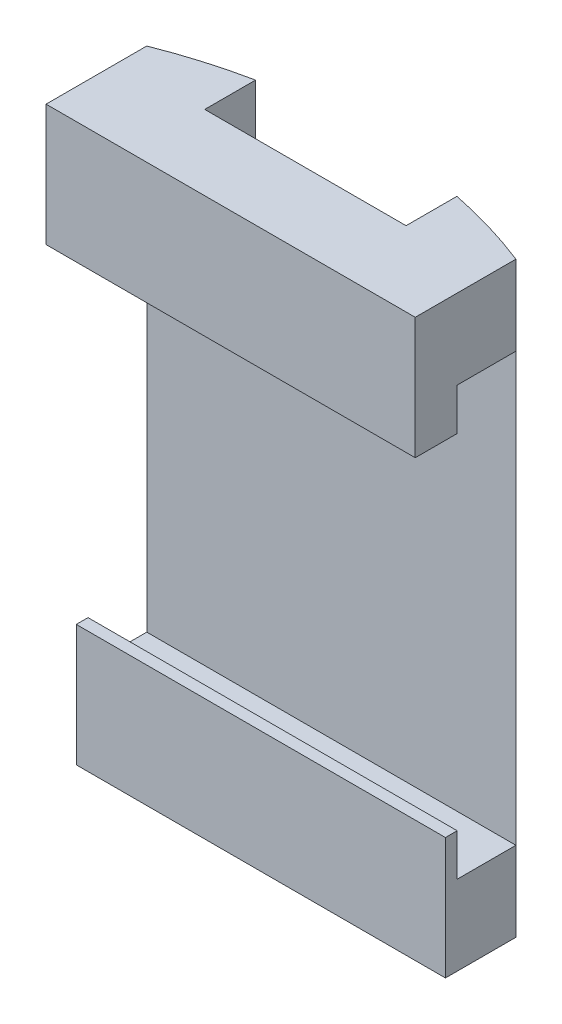
ISO-10303-21;
HEADER;
FILE_DESCRIPTION(('STEP AP214'),'2;1');
FILE_NAME('part.step','',(''),(''),'','','');
FILE_SCHEMA(('AUTOMOTIVE_DESIGN { 1 0 10303 214 1 1 1 1 }'));
ENDSEC;
DATA;
#1=APPLICATION_CONTEXT('core data for automotive mechanical design processes');
#2=APPLICATION_PROTOCOL_DEFINITION('international standard','automotive_design',2000,#1);
#3=PRODUCT_CONTEXT('',#1,'mechanical');
#4=PRODUCT('Part','Part','',(#3));
#5=PRODUCT_RELATED_PRODUCT_CATEGORY('part','',(#4));
#6=PRODUCT_DEFINITION_FORMATION('','',#4);
#7=PRODUCT_DEFINITION_CONTEXT('part definition',#1,'design');
#8=PRODUCT_DEFINITION('design','',#6,#7);
#9=PRODUCT_DEFINITION_SHAPE('','',#8);
#10=(LENGTH_UNIT() NAMED_UNIT(*) SI_UNIT(.MILLI.,.METRE.));
#11=(NAMED_UNIT(*) PLANE_ANGLE_UNIT() SI_UNIT($,.RADIAN.));
#12=(NAMED_UNIT(*) SI_UNIT($,.STERADIAN.) SOLID_ANGLE_UNIT());
#13=UNCERTAINTY_MEASURE_WITH_UNIT(LENGTH_MEASURE(1.E-05),#10,'distance_accuracy_value','');
#14=(GEOMETRIC_REPRESENTATION_CONTEXT(3) GLOBAL_UNCERTAINTY_ASSIGNED_CONTEXT((#13)) GLOBAL_UNIT_ASSIGNED_CONTEXT((#10,
#11,#12)) REPRESENTATION_CONTEXT('',''));
#15=CARTESIAN_POINT('',(0.,0.,0.));
#16=DIRECTION('',(0.,0.,1.));
#17=DIRECTION('',(1.,0.,0.));
#18=AXIS2_PLACEMENT_3D('',#15,#16,#17);
#19=CARTESIAN_POINT('',(0.,0.,0.));
#20=DIRECTION('',(0.,1.,0.));
#21=DIRECTION('',(0.,0.,1.));
#22=AXIS2_PLACEMENT_3D('',#19,#20,#21);
#23=PLANE('',#22);
#24=DIRECTION('',(1.,0.,0.));
#25=VECTOR('',#24,1.);
#26=CARTESIAN_POINT('',(-11.,0.,-23.7105714739057));
#27=LINE('',#26,#25);
#28=CARTESIAN_POINT('',(-11.,0.,-23.7105714739057));
#29=VERTEX_POINT('',#28);
#30=CARTESIAN_POINT('',(11.,0.,-23.7105714739057));
#31=VERTEX_POINT('',#30);
#32=EDGE_CURVE('E216',#29,#31,#27,.T.);
#33=ORIENTED_EDGE('',*,*,#32,.F.);
#34=DIRECTION('',(0.,0.,-1.));
#35=VECTOR('',#34,1.);
#36=CARTESIAN_POINT('',(-11.,0.,-21.9105714739057));
#37=LINE('',#36,#35);
#38=CARTESIAN_POINT('',(-11.,0.,-27.9105714739057));
#39=VERTEX_POINT('',#38);
#40=EDGE_CURVE('E293',#29,#39,#37,.T.);
#41=ORIENTED_EDGE('',*,*,#40,.T.);
#42=CARTESIAN_POINT('',(0.,0.,0.));
#43=DIRECTION('',(0.,1.,0.));
#44=DIRECTION('',(0.,0.,1.));
#45=AXIS2_PLACEMENT_3D('',#42,#43,#44);
#46=CIRCLE('',#45,30.);
#47=CARTESIAN_POINT('',(11.,0.,-27.9105714739057));
#48=VERTEX_POINT('',#47);
#49=EDGE_CURVE('E324',#48,#39,#46,.T.);
#50=ORIENTED_EDGE('',*,*,#49,.F.);
#51=DIRECTION('',(0.,0.,-1.));
#52=VECTOR('',#51,1.);
#53=CARTESIAN_POINT('',(11.,0.,-21.9105714739057));
#54=LINE('',#53,#52);
#55=EDGE_CURVE('E290',#31,#48,#54,.T.);
#56=ORIENTED_EDGE('',*,*,#55,.F.);
#57=EDGE_LOOP('',(#33,#41,#50,#56));
#58=FACE_BOUND('',#57,.T.);
#59=ADVANCED_FACE('F38',(#58),#23,.F.);
#60=CARTESIAN_POINT('',(-11.,4.75,-21.9105714739057));
#61=DIRECTION('',(1.,0.,0.));
#62=DIRECTION('',(0.,0.,-1.));
#63=AXIS2_PLACEMENT_3D('',#60,#61,#62);
#64=PLANE('',#63);
#65=DIRECTION('',(0.,-1.,0.));
#66=VECTOR('',#65,1.);
#67=CARTESIAN_POINT('',(-11.,7.25,-23.7105714739057));
#68=LINE('',#67,#66);
#69=CARTESIAN_POINT('',(-11.,7.25,-23.7105714739057));
#70=VERTEX_POINT('',#69);
#71=EDGE_CURVE('E213',#70,#29,#68,.T.);
#72=ORIENTED_EDGE('',*,*,#71,.F.);
#73=DIRECTION('',(0.,0.,-1.));
#74=VECTOR('',#73,1.);
#75=CARTESIAN_POINT('',(-11.,7.25,-21.9105714739057));
#76=LINE('',#75,#74);
#77=CARTESIAN_POINT('',(-11.,7.25,-24.4105714739057));
#78=VERTEX_POINT('',#77);
#79=EDGE_CURVE('E225',#70,#78,#76,.T.);
#80=ORIENTED_EDGE('',*,*,#79,.T.);
#81=DIRECTION('',(0.,-1.,0.));
#82=VECTOR('',#81,1.);
#83=CARTESIAN_POINT('',(-11.,4.75,-24.4105714739057));
#84=LINE('',#83,#82);
#85=CARTESIAN_POINT('',(-11.,4.75,-24.4105714739057));
#86=VERTEX_POINT('',#85);
#87=EDGE_CURVE('E230',#78,#86,#84,.T.);
#88=ORIENTED_EDGE('',*,*,#87,.T.);
#89=DIRECTION('',(0.,0.,-1.));
#90=VECTOR('',#89,1.);
#91=CARTESIAN_POINT('',(-11.,4.75,-21.9105714739057));
#92=LINE('',#91,#90);
#93=CARTESIAN_POINT('',(-11.,4.75,-27.9105714739057));
#94=VERTEX_POINT('',#93);
#95=EDGE_CURVE('E284',#86,#94,#92,.T.);
#96=ORIENTED_EDGE('',*,*,#95,.T.);
#97=DIRECTION('',(0.,-1.,0.));
#98=VECTOR('',#97,1.);
#99=CARTESIAN_POINT('',(-11.,4.75,-27.9105714739057));
#100=LINE('',#99,#98);
#101=EDGE_CURVE('E266',#94,#39,#100,.T.);
#102=ORIENTED_EDGE('',*,*,#101,.T.);
#103=ORIENTED_EDGE('',*,*,#40,.F.);
#104=EDGE_LOOP('',(#72,#80,#88,#96,#102,#103));
#105=FACE_BOUND('',#104,.T.);
#106=ADVANCED_FACE('F400',(#105),#64,.F.);
#107=CARTESIAN_POINT('',(11.,4.75,-21.9105714739057));
#108=DIRECTION('',(-1.,0.,0.));
#109=DIRECTION('',(0.,0.,1.));
#110=AXIS2_PLACEMENT_3D('',#107,#108,#109);
#111=PLANE('',#110);
#112=DIRECTION('',(0.,1.,0.));
#113=VECTOR('',#112,1.);
#114=CARTESIAN_POINT('',(11.,7.25,-23.7105714739057));
#115=LINE('',#114,#113);
#116=CARTESIAN_POINT('',(11.,7.25,-23.7105714739057));
#117=VERTEX_POINT('',#116);
#118=EDGE_CURVE('E219',#31,#117,#115,.T.);
#119=ORIENTED_EDGE('',*,*,#118,.F.);
#120=ORIENTED_EDGE('',*,*,#55,.T.);
#121=DIRECTION('',(0.,1.,0.));
#122=VECTOR('',#121,1.);
#123=CARTESIAN_POINT('',(11.,4.75,-27.9105714739057));
#124=LINE('',#123,#122);
#125=CARTESIAN_POINT('',(11.,4.75,-27.9105714739057));
#126=VERTEX_POINT('',#125);
#127=EDGE_CURVE('E276',#48,#126,#124,.T.);
#128=ORIENTED_EDGE('',*,*,#127,.T.);
#129=DIRECTION('',(0.,0.,-1.));
#130=VECTOR('',#129,1.);
#131=CARTESIAN_POINT('',(11.,4.75,-21.9105714739057));
#132=LINE('',#131,#130);
#133=CARTESIAN_POINT('',(11.,4.75,-24.4105714739057));
#134=VERTEX_POINT('',#133);
#135=EDGE_CURVE('E287',#134,#126,#132,.T.);
#136=ORIENTED_EDGE('',*,*,#135,.F.);
#137=DIRECTION('',(0.,-1.,0.));
#138=VECTOR('',#137,1.);
#139=CARTESIAN_POINT('',(11.,4.75,-24.4105714739057));
#140=LINE('',#139,#138);
#141=CARTESIAN_POINT('',(11.,7.25,-24.4105714739057));
#142=VERTEX_POINT('',#141);
#143=EDGE_CURVE('E229',#142,#134,#140,.T.);
#144=ORIENTED_EDGE('',*,*,#143,.F.);
#145=DIRECTION('',(0.,0.,-1.));
#146=VECTOR('',#145,1.);
#147=CARTESIAN_POINT('',(11.,7.25,-21.9105714739057));
#148=LINE('',#147,#146);
#149=EDGE_CURVE('E226',#117,#142,#148,.T.);
#150=ORIENTED_EDGE('',*,*,#149,.F.);
#151=EDGE_LOOP('',(#119,#120,#128,#136,#144,#150));
#152=FACE_BOUND('',#151,.T.);
#153=ADVANCED_FACE('F392',(#152),#111,.F.);
#154=CARTESIAN_POINT('',(11.,7.25,-21.9105714739057));
#155=DIRECTION('',(0.,1.,0.));
#156=DIRECTION('',(0.,0.,1.));
#157=AXIS2_PLACEMENT_3D('',#154,#155,#156);
#158=PLANE('',#157);
#159=ORIENTED_EDGE('',*,*,#79,.F.);
#160=DIRECTION('',(-1.,0.,0.));
#161=VECTOR('',#160,1.);
#162=CARTESIAN_POINT('',(-11.,7.25,-23.7105714739057));
#163=LINE('',#162,#161);
#164=EDGE_CURVE('E222',#117,#70,#163,.T.);
#165=ORIENTED_EDGE('',*,*,#164,.F.);
#166=ORIENTED_EDGE('',*,*,#149,.T.);
#167=DIRECTION('',(-1.,0.,0.));
#168=VECTOR('',#167,1.);
#169=CARTESIAN_POINT('',(11.,7.25,-24.4105714739057));
#170=LINE('',#169,#168);
#171=EDGE_CURVE('E233',#142,#78,#170,.T.);
#172=ORIENTED_EDGE('',*,*,#171,.T.);
#173=EDGE_LOOP('',(#159,#165,#166,#172));
#174=FACE_BOUND('',#173,.T.);
#175=ADVANCED_FACE('F407',(#174),#158,.T.);
#176=CARTESIAN_POINT('',(-11.,35.,-27.9105714739057));
#177=DIRECTION('',(0.,0.,-1.));
#178=DIRECTION('',(-1.,0.,0.));
#179=AXIS2_PLACEMENT_3D('',#176,#177,#178);
#180=PLANE('',#179);
#181=DIRECTION('',(-1.,0.,0.));
#182=VECTOR('',#181,1.);
#183=CARTESIAN_POINT('',(-11.,25.2,-27.9105714739057));
#184=LINE('',#183,#182);
#185=CARTESIAN_POINT('',(6.,25.2,-27.9105714739057));
#186=VERTEX_POINT('',#185);
#187=CARTESIAN_POINT('',(-6.,25.2,-27.9105714739057));
#188=VERTEX_POINT('',#187);
#189=EDGE_CURVE('E209',#186,#188,#184,.T.);
#190=ORIENTED_EDGE('',*,*,#189,.T.);
#191=DIRECTION('',(0.,1.,0.));
#192=VECTOR('',#191,1.);
#193=CARTESIAN_POINT('',(-6.,35.,-27.9105714739057));
#194=LINE('',#193,#192);
#195=CARTESIAN_POINT('',(-6.,30.25,-27.9105714739057));
#196=VERTEX_POINT('',#195);
#197=EDGE_CURVE('E201',#188,#196,#194,.T.);
#198=ORIENTED_EDGE('',*,*,#197,.T.);
#199=DIRECTION('',(1.,0.,0.));
#200=VECTOR('',#199,1.);
#201=CARTESIAN_POINT('',(-11.,30.25,-27.9105714739057));
#202=LINE('',#201,#200);
#203=CARTESIAN_POINT('',(-11.,30.25,-27.9105714739057));
#204=VERTEX_POINT('',#203);
#205=EDGE_CURVE('E301',#204,#196,#202,.T.);
#206=ORIENTED_EDGE('',*,*,#205,.F.);
#207=DIRECTION('',(0.,-1.,0.));
#208=VECTOR('',#207,1.);
#209=CARTESIAN_POINT('',(-11.,35.,-27.9105714739057));
#210=LINE('',#209,#208);
#211=EDGE_CURVE('E336',#204,#94,#210,.T.);
#212=ORIENTED_EDGE('',*,*,#211,.T.);
#213=DIRECTION('',(-1.,0.,0.));
#214=VECTOR('',#213,1.);
#215=CARTESIAN_POINT('',(-11.,4.75,-27.9105714739057));
#216=LINE('',#215,#214);
#217=EDGE_CURVE('E280',#126,#94,#216,.T.);
#218=ORIENTED_EDGE('',*,*,#217,.F.);
#219=DIRECTION('',(0.,-1.,0.));
#220=VECTOR('',#219,1.);
#221=CARTESIAN_POINT('',(11.,35.,-27.9105714739057));
#222=LINE('',#221,#220);
#223=CARTESIAN_POINT('',(11.,30.25,-27.9105714739057));
#224=VERTEX_POINT('',#223);
#225=EDGE_CURVE('E327',#224,#126,#222,.T.);
#226=ORIENTED_EDGE('',*,*,#225,.F.);
#227=CARTESIAN_POINT('',(6.,30.25,-27.9105714739057));
#228=VERTEX_POINT('',#227);
#229=EDGE_CURVE('E296',#228,#224,#202,.T.);
#230=ORIENTED_EDGE('',*,*,#229,.F.);
#231=DIRECTION('',(0.,-1.,0.));
#232=VECTOR('',#231,1.);
#233=CARTESIAN_POINT('',(6.,35.,-27.9105714739057));
#234=LINE('',#233,#232);
#235=EDGE_CURVE('E170',#228,#186,#234,.T.);
#236=ORIENTED_EDGE('',*,*,#235,.T.);
#237=EDGE_LOOP('',(#190,#198,#206,#212,#218,#226,#230,#236));
#238=FACE_BOUND('',#237,.T.);
#239=ADVANCED_FACE('F354',(#238),#180,.F.);
#240=CARTESIAN_POINT('',(0.,35.,0.));
#241=DIRECTION('',(0.,-1.,0.));
#242=DIRECTION('',(0.,0.,-1.));
#243=AXIS2_PLACEMENT_3D('',#240,#241,#242);
#244=CYLINDRICAL_SURFACE('',#243,30.);
#245=CARTESIAN_POINT('',(0.,35.,0.));
#246=DIRECTION('',(0.,1.,0.));
#247=DIRECTION('',(0.,0.,1.));
#248=AXIS2_PLACEMENT_3D('',#245,#246,#247);
#249=CIRCLE('',#248,30.);
#250=CARTESIAN_POINT('',(-6.,35.,-29.3938769133981));
#251=VERTEX_POINT('',#250);
#252=CARTESIAN_POINT('',(-11.,35.,-27.9105714739057));
#253=VERTEX_POINT('',#252);
#254=EDGE_CURVE('E328',#251,#253,#249,.T.);
#255=ORIENTED_EDGE('',*,*,#254,.F.);
#256=DIRECTION('',(0.,-1.,0.));
#257=VECTOR('',#256,1.);
#258=CARTESIAN_POINT('',(-6.,35.,-29.3938769133981));
#259=LINE('',#258,#257);
#260=CARTESIAN_POINT('',(-6.,25.2,-29.3938769133981));
#261=VERTEX_POINT('',#260);
#262=EDGE_CURVE('E205',#251,#261,#259,.T.);
#263=ORIENTED_EDGE('',*,*,#262,.T.);
#264=CARTESIAN_POINT('',(0.,25.2,0.));
#265=DIRECTION('',(0.,-1.,0.));
#266=DIRECTION('',(0.,0.,-1.));
#267=AXIS2_PLACEMENT_3D('',#264,#265,#266);
#268=CIRCLE('',#267,30.);
#269=CARTESIAN_POINT('',(6.,25.2,-29.3938769133981));
#270=VERTEX_POINT('',#269);
#271=EDGE_CURVE('E11',#261,#270,#268,.T.);
#272=ORIENTED_EDGE('',*,*,#271,.T.);
#273=DIRECTION('',(0.,-1.,0.));
#274=VECTOR('',#273,1.);
#275=CARTESIAN_POINT('',(6.,35.,-29.3938769133981));
#276=LINE('',#275,#274);
#277=CARTESIAN_POINT('',(6.,35.,-29.3938769133981));
#278=VERTEX_POINT('',#277);
#279=EDGE_CURVE('E198',#270,#278,#276,.F.);
#280=ORIENTED_EDGE('',*,*,#279,.T.);
#281=CARTESIAN_POINT('',(11.,35.,-27.9105714739057));
#282=VERTEX_POINT('',#281);
#283=EDGE_CURVE('E183',#282,#278,#249,.T.);
#284=ORIENTED_EDGE('',*,*,#283,.F.);
#285=EDGE_CURVE('E332',#282,#224,#222,.T.);
#286=ORIENTED_EDGE('',*,*,#285,.T.);
#287=ORIENTED_EDGE('',*,*,#225,.T.);
#288=ORIENTED_EDGE('',*,*,#127,.F.);
#289=ORIENTED_EDGE('',*,*,#49,.T.);
#290=ORIENTED_EDGE('',*,*,#101,.F.);
#291=ORIENTED_EDGE('',*,*,#211,.F.);
#292=EDGE_CURVE('E337',#253,#204,#210,.T.);
#293=ORIENTED_EDGE('',*,*,#292,.F.);
#294=EDGE_LOOP('',(#255,#263,#272,#280,#284,#286,#287,#288,#289,#290,#291,#293));
#295=FACE_BOUND('',#294,.T.);
#296=ADVANCED_FACE('F40',(#295),#244,.T.);
#297=CARTESIAN_POINT('',(0.,35.,0.));
#298=DIRECTION('',(0.,1.,0.));
#299=DIRECTION('',(0.,0.,1.));
#300=AXIS2_PLACEMENT_3D('',#297,#298,#299);
#301=PLANE('',#300);
#302=DIRECTION('',(0.,0.,1.));
#303=VECTOR('',#302,1.);
#304=CARTESIAN_POINT('',(-6.,35.,-26.3645475346086));
#305=LINE('',#304,#303);
#306=CARTESIAN_POINT('',(-6.,35.,-26.3645475346086));
#307=VERTEX_POINT('',#306);
#308=EDGE_CURVE('E178',#251,#307,#305,.T.);
#309=ORIENTED_EDGE('',*,*,#308,.F.);
#310=ORIENTED_EDGE('',*,*,#254,.T.);
#311=DIRECTION('',(0.,0.,-1.));
#312=VECTOR('',#311,1.);
#313=CARTESIAN_POINT('',(-11.,35.,-21.9105714739057));
#314=LINE('',#313,#312);
#315=CARTESIAN_POINT('',(-11.,35.,-21.9105714739057));
#316=VERTEX_POINT('',#315);
#317=EDGE_CURVE('E307',#316,#253,#314,.T.);
#318=ORIENTED_EDGE('',*,*,#317,.F.);
#319=DIRECTION('',(-1.,0.,0.));
#320=VECTOR('',#319,1.);
#321=CARTESIAN_POINT('',(-11.,35.,-21.9105714739057));
#322=LINE('',#321,#320);
#323=CARTESIAN_POINT('',(11.,35.,-21.9105714739057));
#324=VERTEX_POINT('',#323);
#325=EDGE_CURVE('E304',#324,#316,#322,.T.);
#326=ORIENTED_EDGE('',*,*,#325,.F.);
#327=DIRECTION('',(0.,0.,-1.));
#328=VECTOR('',#327,1.);
#329=CARTESIAN_POINT('',(11.,35.,-21.9105714739057));
#330=LINE('',#329,#328);
#331=EDGE_CURVE('E314',#324,#282,#330,.T.);
#332=ORIENTED_EDGE('',*,*,#331,.T.);
#333=ORIENTED_EDGE('',*,*,#283,.T.);
#334=DIRECTION('',(0.,0.,-1.));
#335=VECTOR('',#334,1.);
#336=CARTESIAN_POINT('',(6.,35.,-26.3645475346086));
#337=LINE('',#336,#335);
#338=CARTESIAN_POINT('',(6.,35.,-26.3645475346086));
#339=VERTEX_POINT('',#338);
#340=EDGE_CURVE('E164',#339,#278,#337,.T.);
#341=ORIENTED_EDGE('',*,*,#340,.F.);
#342=DIRECTION('',(1.,0.,0.));
#343=VECTOR('',#342,1.);
#344=CARTESIAN_POINT('',(-6.,35.,-26.3645475346086));
#345=LINE('',#344,#343);
#346=EDGE_CURVE('E173',#307,#339,#345,.T.);
#347=ORIENTED_EDGE('',*,*,#346,.F.);
#348=EDGE_LOOP('',(#309,#310,#318,#326,#332,#333,#341,#347));
#349=FACE_BOUND('',#348,.T.);
#350=ADVANCED_FACE('F181',(#349),#301,.T.);
#351=CARTESIAN_POINT('',(-11.,35.,-21.9105714739057));
#352=DIRECTION('',(1.,0.,0.));
#353=DIRECTION('',(0.,0.,-1.));
#354=AXIS2_PLACEMENT_3D('',#351,#352,#353);
#355=PLANE('',#354);
#356=ORIENTED_EDGE('',*,*,#292,.T.);
#357=DIRECTION('',(0.,0.,-1.));
#358=VECTOR('',#357,1.);
#359=CARTESIAN_POINT('',(-11.,30.25,-21.9105714739057));
#360=LINE('',#359,#358);
#361=CARTESIAN_POINT('',(-11.,30.25,-24.4105714739057));
#362=VERTEX_POINT('',#361);
#363=EDGE_CURVE('E321',#362,#204,#360,.T.);
#364=ORIENTED_EDGE('',*,*,#363,.F.);
#365=DIRECTION('',(0.,-1.,0.));
#366=VECTOR('',#365,1.);
#367=CARTESIAN_POINT('',(-11.,30.25,-24.4105714739057));
#368=LINE('',#367,#366);
#369=CARTESIAN_POINT('',(-11.,27.75,-24.4105714739057));
#370=VERTEX_POINT('',#369);
#371=EDGE_CURVE('E242',#362,#370,#368,.T.);
#372=ORIENTED_EDGE('',*,*,#371,.T.);
#373=DIRECTION('',(0.,0.,1.));
#374=VECTOR('',#373,1.);
#375=CARTESIAN_POINT('',(-11.,27.75,-21.9105714739057));
#376=LINE('',#375,#374);
#377=CARTESIAN_POINT('',(-11.,27.75,-21.9105714739057));
#378=VERTEX_POINT('',#377);
#379=EDGE_CURVE('E251',#370,#378,#376,.T.);
#380=ORIENTED_EDGE('',*,*,#379,.T.);
#381=DIRECTION('',(0.,-1.,0.));
#382=VECTOR('',#381,1.);
#383=CARTESIAN_POINT('',(-11.,35.,-21.9105714739057));
#384=LINE('',#383,#382);
#385=EDGE_CURVE('E297',#316,#378,#384,.T.);
#386=ORIENTED_EDGE('',*,*,#385,.F.);
#387=ORIENTED_EDGE('',*,*,#317,.T.);
#388=EDGE_LOOP('',(#356,#364,#372,#380,#386,#387));
#389=FACE_BOUND('',#388,.T.);
#390=ADVANCED_FACE('F459',(#389),#355,.F.);
#391=CARTESIAN_POINT('',(-11.,30.25,-21.9105714739057));
#392=DIRECTION('',(0.,1.,0.));
#393=DIRECTION('',(0.,0.,1.));
#394=AXIS2_PLACEMENT_3D('',#391,#392,#393);
#395=PLANE('',#394);
#396=ORIENTED_EDGE('',*,*,#205,.T.);
#397=DIRECTION('',(0.,0.,1.));
#398=VECTOR('',#397,1.);
#399=CARTESIAN_POINT('',(-6.,30.25,-21.9105714739057));
#400=LINE('',#399,#398);
#401=CARTESIAN_POINT('',(-6.,30.25,-26.3645475346086));
#402=VERTEX_POINT('',#401);
#403=EDGE_CURVE('E47',#196,#402,#400,.T.);
#404=ORIENTED_EDGE('',*,*,#403,.T.);
#405=DIRECTION('',(1.,0.,0.));
#406=VECTOR('',#405,1.);
#407=CARTESIAN_POINT('',(-11.,30.25,-26.3645475346086));
#408=LINE('',#407,#406);
#409=CARTESIAN_POINT('',(6.,30.25,-26.3645475346086));
#410=VERTEX_POINT('',#409);
#411=EDGE_CURVE('E341',#402,#410,#408,.T.);
#412=ORIENTED_EDGE('',*,*,#411,.T.);
#413=DIRECTION('',(0.,0.,-1.));
#414=VECTOR('',#413,1.);
#415=CARTESIAN_POINT('',(6.,30.25,-21.9105714739057));
#416=LINE('',#415,#414);
#417=EDGE_CURVE('E167',#410,#228,#416,.T.);
#418=ORIENTED_EDGE('',*,*,#417,.T.);
#419=ORIENTED_EDGE('',*,*,#229,.T.);
#420=DIRECTION('',(0.,0.,-1.));
#421=VECTOR('',#420,1.);
#422=CARTESIAN_POINT('',(11.,30.25,-21.9105714739057));
#423=LINE('',#422,#421);
#424=CARTESIAN_POINT('',(11.,30.25,-24.4105714739057));
#425=VERTEX_POINT('',#424);
#426=EDGE_CURVE('E317',#425,#224,#423,.T.);
#427=ORIENTED_EDGE('',*,*,#426,.F.);
#428=DIRECTION('',(-1.,0.,0.));
#429=VECTOR('',#428,1.);
#430=CARTESIAN_POINT('',(11.,30.25,-24.4105714739057));
#431=LINE('',#430,#429);
#432=EDGE_CURVE('E255',#425,#362,#431,.T.);
#433=ORIENTED_EDGE('',*,*,#432,.T.);
#434=ORIENTED_EDGE('',*,*,#363,.T.);
#435=EDGE_LOOP('',(#396,#404,#412,#418,#419,#427,#433,#434));
#436=FACE_BOUND('',#435,.T.);
#437=ADVANCED_FACE('F348',(#436),#395,.F.);
#438=CARTESIAN_POINT('',(11.,35.,-21.9105714739057));
#439=DIRECTION('',(-1.,0.,0.));
#440=DIRECTION('',(0.,0.,1.));
#441=AXIS2_PLACEMENT_3D('',#438,#439,#440);
#442=PLANE('',#441);
#443=ORIENTED_EDGE('',*,*,#285,.F.);
#444=ORIENTED_EDGE('',*,*,#331,.F.);
#445=DIRECTION('',(0.,1.,0.));
#446=VECTOR('',#445,1.);
#447=CARTESIAN_POINT('',(11.,35.,-21.9105714739057));
#448=LINE('',#447,#446);
#449=CARTESIAN_POINT('',(11.,27.75,-21.9105714739057));
#450=VERTEX_POINT('',#449);
#451=EDGE_CURVE('E300',#450,#324,#448,.T.);
#452=ORIENTED_EDGE('',*,*,#451,.F.);
#453=DIRECTION('',(0.,0.,1.));
#454=VECTOR('',#453,1.);
#455=CARTESIAN_POINT('',(11.,27.75,-21.9105714739057));
#456=LINE('',#455,#454);
#457=CARTESIAN_POINT('',(11.,27.75,-24.4105714739057));
#458=VERTEX_POINT('',#457);
#459=EDGE_CURVE('E250',#458,#450,#456,.T.);
#460=ORIENTED_EDGE('',*,*,#459,.F.);
#461=DIRECTION('',(0.,-1.,0.));
#462=VECTOR('',#461,1.);
#463=CARTESIAN_POINT('',(11.,30.25,-24.4105714739057));
#464=LINE('',#463,#462);
#465=EDGE_CURVE('E246',#425,#458,#464,.T.);
#466=ORIENTED_EDGE('',*,*,#465,.F.);
#467=ORIENTED_EDGE('',*,*,#426,.T.);
#468=EDGE_LOOP('',(#443,#444,#452,#460,#466,#467));
#469=FACE_BOUND('',#468,.T.);
#470=ADVANCED_FACE('F376',(#469),#442,.F.);
#471=CARTESIAN_POINT('',(0.,0.,-21.9105714739057));
#472=DIRECTION('',(0.,0.,1.));
#473=DIRECTION('',(1.,0.,0.));
#474=AXIS2_PLACEMENT_3D('',#471,#472,#473);
#475=PLANE('',#474);
#476=ORIENTED_EDGE('',*,*,#385,.T.);
#477=DIRECTION('',(-1.,0.,0.));
#478=VECTOR('',#477,1.);
#479=CARTESIAN_POINT('',(11.,27.75,-21.9105714739057));
#480=LINE('',#479,#478);
#481=EDGE_CURVE('E262',#450,#378,#480,.T.);
#482=ORIENTED_EDGE('',*,*,#481,.F.);
#483=ORIENTED_EDGE('',*,*,#451,.T.);
#484=ORIENTED_EDGE('',*,*,#325,.T.);
#485=EDGE_LOOP('',(#476,#482,#483,#484));
#486=FACE_BOUND('',#485,.T.);
#487=ADVANCED_FACE('F451',(#486),#475,.T.);
#488=CARTESIAN_POINT('',(-11.,4.75,-21.9105714739057));
#489=DIRECTION('',(0.,-1.,0.));
#490=DIRECTION('',(0.,0.,-1.));
#491=AXIS2_PLACEMENT_3D('',#488,#489,#490);
#492=PLANE('',#491);
#493=ORIENTED_EDGE('',*,*,#95,.F.);
#494=DIRECTION('',(-1.,0.,0.));
#495=VECTOR('',#494,1.);
#496=CARTESIAN_POINT('',(11.,4.75,-24.4105714739057));
#497=LINE('',#496,#495);
#498=EDGE_CURVE('E239',#134,#86,#497,.T.);
#499=ORIENTED_EDGE('',*,*,#498,.F.);
#500=ORIENTED_EDGE('',*,*,#135,.T.);
#501=ORIENTED_EDGE('',*,*,#217,.T.);
#502=EDGE_LOOP('',(#493,#499,#500,#501));
#503=FACE_BOUND('',#502,.T.);
#504=ADVANCED_FACE('F386',(#503),#492,.F.);
#505=CARTESIAN_POINT('',(11.,27.75,-21.9105714739057));
#506=DIRECTION('',(0.,-1.,0.));
#507=DIRECTION('',(0.,0.,-1.));
#508=AXIS2_PLACEMENT_3D('',#505,#506,#507);
#509=PLANE('',#508);
#510=ORIENTED_EDGE('',*,*,#379,.F.);
#511=DIRECTION('',(-1.,0.,0.));
#512=VECTOR('',#511,1.);
#513=CARTESIAN_POINT('',(11.,27.75,-24.4105714739057));
#514=LINE('',#513,#512);
#515=EDGE_CURVE('E267',#458,#370,#514,.T.);
#516=ORIENTED_EDGE('',*,*,#515,.F.);
#517=ORIENTED_EDGE('',*,*,#459,.T.);
#518=ORIENTED_EDGE('',*,*,#481,.T.);
#519=EDGE_LOOP('',(#510,#516,#517,#518));
#520=FACE_BOUND('',#519,.T.);
#521=ADVANCED_FACE('F443',(#520),#509,.T.);
#522=CARTESIAN_POINT('',(11.,30.25,-24.4105714739057));
#523=DIRECTION('',(0.,0.,-1.));
#524=DIRECTION('',(-1.,0.,0.));
#525=AXIS2_PLACEMENT_3D('',#522,#523,#524);
#526=PLANE('',#525);
#527=ORIENTED_EDGE('',*,*,#371,.F.);
#528=ORIENTED_EDGE('',*,*,#432,.F.);
#529=ORIENTED_EDGE('',*,*,#465,.T.);
#530=ORIENTED_EDGE('',*,*,#515,.T.);
#531=EDGE_LOOP('',(#527,#528,#529,#530));
#532=FACE_BOUND('',#531,.T.);
#533=ADVANCED_FACE('F420',(#532),#526,.T.);
#534=CARTESIAN_POINT('',(11.,4.75,-24.4105714739057));
#535=DIRECTION('',(0.,0.,-1.));
#536=DIRECTION('',(-1.,0.,0.));
#537=AXIS2_PLACEMENT_3D('',#534,#535,#536);
#538=PLANE('',#537);
#539=ORIENTED_EDGE('',*,*,#87,.F.);
#540=ORIENTED_EDGE('',*,*,#171,.F.);
#541=ORIENTED_EDGE('',*,*,#143,.T.);
#542=ORIENTED_EDGE('',*,*,#498,.T.);
#543=EDGE_LOOP('',(#539,#540,#541,#542));
#544=FACE_BOUND('',#543,.T.);
#545=ADVANCED_FACE('F405',(#544),#538,.T.);
#546=CARTESIAN_POINT('',(0.,0.,-23.7105714739057));
#547=DIRECTION('',(0.,0.,1.));
#548=DIRECTION('',(1.,0.,0.));
#549=AXIS2_PLACEMENT_3D('',#546,#547,#548);
#550=PLANE('',#549);
#551=ORIENTED_EDGE('',*,*,#71,.T.);
#552=ORIENTED_EDGE('',*,*,#32,.T.);
#553=ORIENTED_EDGE('',*,*,#118,.T.);
#554=ORIENTED_EDGE('',*,*,#164,.T.);
#555=EDGE_LOOP('',(#551,#552,#553,#554));
#556=FACE_BOUND('',#555,.T.);
#557=ADVANCED_FACE('F411',(#556),#550,.T.);
#558=CARTESIAN_POINT('',(0.,25.2,0.));
#559=DIRECTION('',(0.,-1.,0.));
#560=DIRECTION('',(0.,0.,-1.));
#561=AXIS2_PLACEMENT_3D('',#558,#559,#560);
#562=PLANE('',#561);
#563=DIRECTION('',(0.,0.,-1.));
#564=VECTOR('',#563,1.);
#565=CARTESIAN_POINT('',(6.,25.2,-26.3645475346086));
#566=LINE('',#565,#564);
#567=EDGE_CURVE('E189',#186,#270,#566,.T.);
#568=ORIENTED_EDGE('',*,*,#567,.T.);
#569=ORIENTED_EDGE('',*,*,#271,.F.);
#570=DIRECTION('',(0.,0.,1.));
#571=VECTOR('',#570,1.);
#572=CARTESIAN_POINT('',(-6.,25.2,-26.3645475346086));
#573=LINE('',#572,#571);
#574=EDGE_CURVE('E185',#261,#188,#573,.T.);
#575=ORIENTED_EDGE('',*,*,#574,.T.);
#576=ORIENTED_EDGE('',*,*,#189,.F.);
#577=EDGE_LOOP('',(#568,#569,#575,#576));
#578=FACE_BOUND('',#577,.T.);
#579=ADVANCED_FACE('F360',(#578),#562,.F.);
#580=CARTESIAN_POINT('',(-6.,25.2,-26.3645475346086));
#581=DIRECTION('',(-1.,0.,0.));
#582=DIRECTION('',(0.,0.,1.));
#583=AXIS2_PLACEMENT_3D('',#580,#581,#582);
#584=PLANE('',#583);
#585=ORIENTED_EDGE('',*,*,#308,.T.);
#586=DIRECTION('',(0.,1.,0.));
#587=VECTOR('',#586,1.);
#588=CARTESIAN_POINT('',(-6.,25.2,-26.3645475346086));
#589=LINE('',#588,#587);
#590=EDGE_CURVE('E54',#402,#307,#589,.T.);
#591=ORIENTED_EDGE('',*,*,#590,.F.);
#592=ORIENTED_EDGE('',*,*,#403,.F.);
#593=ORIENTED_EDGE('',*,*,#197,.F.);
#594=ORIENTED_EDGE('',*,*,#574,.F.);
#595=ORIENTED_EDGE('',*,*,#262,.F.);
#596=EDGE_LOOP('',(#585,#591,#592,#593,#594,#595));
#597=FACE_BOUND('',#596,.T.);
#598=ADVANCED_FACE('F351',(#597),#584,.F.);
#599=CARTESIAN_POINT('',(6.,25.2,-26.3645475346086));
#600=DIRECTION('',(1.,0.,0.));
#601=DIRECTION('',(0.,0.,-1.));
#602=AXIS2_PLACEMENT_3D('',#599,#600,#601);
#603=PLANE('',#602);
#604=ORIENTED_EDGE('',*,*,#567,.F.);
#605=ORIENTED_EDGE('',*,*,#235,.F.);
#606=ORIENTED_EDGE('',*,*,#417,.F.);
#607=DIRECTION('',(0.,1.,0.));
#608=VECTOR('',#607,1.);
#609=CARTESIAN_POINT('',(6.,25.2,-26.3645475346086));
#610=LINE('',#609,#608);
#611=EDGE_CURVE('E59',#410,#339,#610,.T.);
#612=ORIENTED_EDGE('',*,*,#611,.T.);
#613=ORIENTED_EDGE('',*,*,#340,.T.);
#614=ORIENTED_EDGE('',*,*,#279,.F.);
#615=EDGE_LOOP('',(#604,#605,#606,#612,#613,#614));
#616=FACE_BOUND('',#615,.T.);
#617=ADVANCED_FACE('F162',(#616),#603,.F.);
#618=CARTESIAN_POINT('',(-6.,25.2,-26.3645475346086));
#619=DIRECTION('',(0.,0.,1.));
#620=DIRECTION('',(1.,0.,0.));
#621=AXIS2_PLACEMENT_3D('',#618,#619,#620);
#622=PLANE('',#621);
#623=ORIENTED_EDGE('',*,*,#590,.T.);
#624=ORIENTED_EDGE('',*,*,#346,.T.);
#625=ORIENTED_EDGE('',*,*,#611,.F.);
#626=ORIENTED_EDGE('',*,*,#411,.F.);
#627=EDGE_LOOP('',(#623,#624,#625,#626));
#628=FACE_BOUND('',#627,.T.);
#629=ADVANCED_FACE('F174',(#628),#622,.F.);
#630=CLOSED_SHELL('',(#59,#106,#153,#175,#239,#296,#350,#390,#437,#470,#487,#504,#521,#533,#545,
#557,#579,#598,#617,#629));
#631=MANIFOLD_SOLID_BREP('B2',#630);
#632=ADVANCED_BREP_SHAPE_REPRESENTATION('',(#18,#631),#14);
#633=SHAPE_DEFINITION_REPRESENTATION(#9,#632);
ENDSEC;
END-ISO-10303-21;
